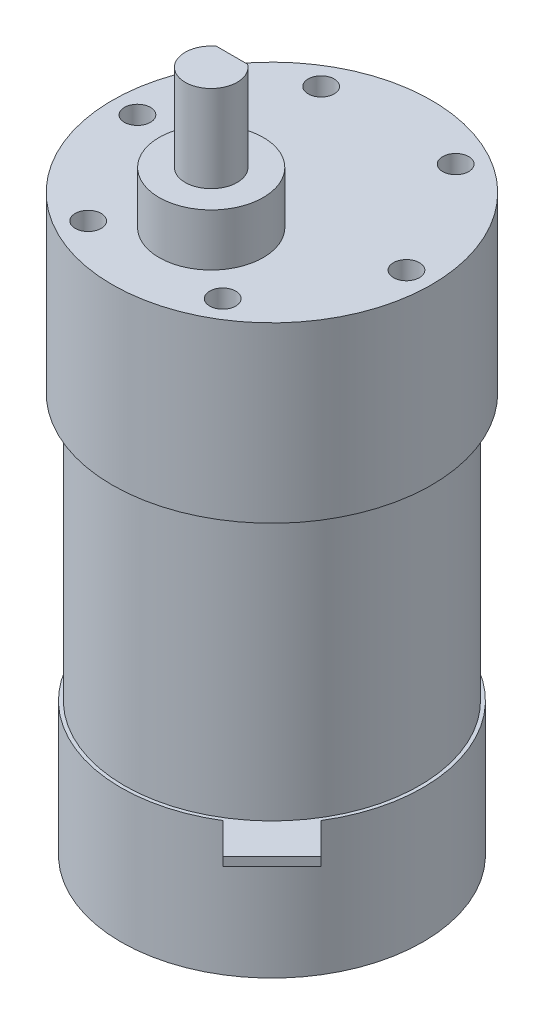
ISO-10303-21;
HEADER;
FILE_DESCRIPTION(('STEP AP214'),'2;1');
FILE_NAME('part.step','',(''),(''),'','','');
FILE_SCHEMA(('AUTOMOTIVE_DESIGN { 1 0 10303 214 1 1 1 1 }'));
ENDSEC;
DATA;
#1=APPLICATION_CONTEXT('core data for automotive mechanical design processes');
#2=APPLICATION_PROTOCOL_DEFINITION('international standard','automotive_design',2000,#1);
#3=PRODUCT_CONTEXT('',#1,'mechanical');
#4=PRODUCT('Part','Part','',(#3));
#5=PRODUCT_RELATED_PRODUCT_CATEGORY('part','',(#4));
#6=PRODUCT_DEFINITION_FORMATION('','',#4);
#7=PRODUCT_DEFINITION_CONTEXT('part definition',#1,'design');
#8=PRODUCT_DEFINITION('design','',#6,#7);
#9=PRODUCT_DEFINITION_SHAPE('','',#8);
#10=(LENGTH_UNIT() NAMED_UNIT(*) SI_UNIT(.MILLI.,.METRE.));
#11=(NAMED_UNIT(*) PLANE_ANGLE_UNIT() SI_UNIT($,.RADIAN.));
#12=(NAMED_UNIT(*) SI_UNIT($,.STERADIAN.) SOLID_ANGLE_UNIT());
#13=UNCERTAINTY_MEASURE_WITH_UNIT(LENGTH_MEASURE(1.E-05),#10,'distance_accuracy_value','');
#14=(GEOMETRIC_REPRESENTATION_CONTEXT(3) GLOBAL_UNCERTAINTY_ASSIGNED_CONTEXT((#13)) GLOBAL_UNIT_ASSIGNED_CONTEXT((#10,
#11,#12)) REPRESENTATION_CONTEXT('',''));
#15=CARTESIAN_POINT('',(0.,0.,0.));
#16=DIRECTION('',(0.,0.,1.));
#17=DIRECTION('',(1.,0.,0.));
#18=AXIS2_PLACEMENT_3D('',#15,#16,#17);
#19=CARTESIAN_POINT('',(0.,15.4,0.));
#20=DIRECTION('',(0.,-1.,0.));
#21=DIRECTION('',(0.,0.,-1.));
#22=AXIS2_PLACEMENT_3D('',#19,#20,#21);
#23=CYLINDRICAL_SURFACE('',#22,17.4);
#24=CARTESIAN_POINT('',(0.,0.,0.));
#25=DIRECTION('',(0.,1.,0.));
#26=DIRECTION('',(0.,0.,1.));
#27=AXIS2_PLACEMENT_3D('',#24,#25,#26);
#28=CIRCLE('',#27,17.4);
#29=CARTESIAN_POINT('',(0.,0.,17.4));
#30=VERTEX_POINT('',#29);
#31=EDGE_CURVE('E148',#30,#30,#28,.T.);
#32=ORIENTED_EDGE('',*,*,#31,.T.);
#33=EDGE_LOOP('',(#32));
#34=FACE_BOUND('',#33,.T.);
#35=DIRECTION('',(0.,-1.,0.));
#36=VECTOR('',#35,1.);
#37=CARTESIAN_POINT('',(14.8025659246767,15.4,9.14571167518424));
#38=LINE('',#37,#36);
#39=CARTESIAN_POINT('',(14.8025659246767,14.4,9.14571167518425));
#40=VERTEX_POINT('',#39);
#41=CARTESIAN_POINT('',(14.8025659246767,15.4,9.14571167518425));
#42=VERTEX_POINT('',#41);
#43=EDGE_CURVE('E112',#40,#42,#38,.F.);
#44=ORIENTED_EDGE('',*,*,#43,.F.);
#45=CARTESIAN_POINT('',(0.,14.4,0.));
#46=DIRECTION('',(0.,-1.,0.));
#47=DIRECTION('',(0.,0.,-1.));
#48=AXIS2_PLACEMENT_3D('',#45,#46,#47);
#49=CIRCLE('',#48,17.4);
#50=CARTESIAN_POINT('',(9.14571167518429,14.4,14.8025659246766));
#51=VERTEX_POINT('',#50);
#52=EDGE_CURVE('E11',#40,#51,#49,.T.);
#53=ORIENTED_EDGE('',*,*,#52,.T.);
#54=DIRECTION('',(0.,-1.,0.));
#55=VECTOR('',#54,1.);
#56=CARTESIAN_POINT('',(9.14571167518428,15.4,14.8025659246766));
#57=LINE('',#56,#55);
#58=CARTESIAN_POINT('',(9.14571167518429,15.4,14.8025659246766));
#59=VERTEX_POINT('',#58);
#60=EDGE_CURVE('E110',#59,#51,#57,.T.);
#61=ORIENTED_EDGE('',*,*,#60,.F.);
#62=CARTESIAN_POINT('',(0.,15.4,0.));
#63=DIRECTION('',(0.,1.,0.));
#64=DIRECTION('',(0.,0.,1.));
#65=AXIS2_PLACEMENT_3D('',#62,#63,#64);
#66=CIRCLE('',#65,17.4);
#67=EDGE_CURVE('E151',#42,#59,#66,.T.);
#68=ORIENTED_EDGE('',*,*,#67,.F.);
#69=EDGE_LOOP('',(#44,#53,#61,#68));
#70=FACE_BOUND('',#69,.T.);
#71=ADVANCED_FACE('F36',(#34,#70),#23,.T.);
#72=CARTESIAN_POINT('',(0.,15.4,0.));
#73=DIRECTION('',(0.,1.,0.));
#74=DIRECTION('',(0.,0.,1.));
#75=AXIS2_PLACEMENT_3D('',#72,#73,#74);
#76=PLANE('',#75);
#77=ORIENTED_EDGE('',*,*,#67,.T.);
#78=DIRECTION('',(-0.707106781186549,0.,-0.707106781186547));
#79=VECTOR('',#78,1.);
#80=CARTESIAN_POINT('',(-2.82842712474619,15.4,2.82842712474619));
#81=LINE('',#80,#79);
#82=CARTESIAN_POINT('',(12.7279220613579,15.4,18.3847763108502));
#83=VERTEX_POINT('',#82);
#84=EDGE_CURVE('E98',#83,#59,#81,.T.);
#85=ORIENTED_EDGE('',*,*,#84,.F.);
#86=DIRECTION('',(-0.707106781186546,0.,0.707106781186549));
#87=VECTOR('',#86,1.);
#88=CARTESIAN_POINT('',(18.3847763108502,15.4,12.7279220613578));
#89=LINE('',#88,#87);
#90=CARTESIAN_POINT('',(18.3847763108502,15.4,12.7279220613578));
#91=VERTEX_POINT('',#90);
#92=EDGE_CURVE('E188',#91,#83,#89,.T.);
#93=ORIENTED_EDGE('',*,*,#92,.F.);
#94=DIRECTION('',(0.707106781186549,0.,0.707106781186547));
#95=VECTOR('',#94,1.);
#96=CARTESIAN_POINT('',(2.82842712474619,15.4,-2.82842712474619));
#97=LINE('',#96,#95);
#98=EDGE_CURVE('E50',#42,#91,#97,.T.);
#99=ORIENTED_EDGE('',*,*,#98,.F.);
#100=EDGE_LOOP('',(#77,#85,#93,#99));
#101=FACE_BOUND('',#100,.T.);
#102=CARTESIAN_POINT('',(0.,15.4,0.));
#103=DIRECTION('',(0.,1.,0.));
#104=DIRECTION('',(0.,0.,1.));
#105=AXIS2_PLACEMENT_3D('',#102,#103,#104);
#106=CIRCLE('',#105,17.);
#107=CARTESIAN_POINT('',(0.,15.4,17.));
#108=VERTEX_POINT('',#107);
#109=EDGE_CURVE('E133',#108,#108,#106,.T.);
#110=ORIENTED_EDGE('',*,*,#109,.F.);
#111=EDGE_LOOP('',(#110));
#112=FACE_BOUND('',#111,.T.);
#113=ADVANCED_FACE('F175',(#101,#112),#76,.T.);
#114=CARTESIAN_POINT('',(0.,0.,0.));
#115=DIRECTION('',(0.,1.,0.));
#116=DIRECTION('',(0.,0.,1.));
#117=AXIS2_PLACEMENT_3D('',#114,#115,#116);
#118=PLANE('',#117);
#119=ORIENTED_EDGE('',*,*,#31,.F.);
#120=EDGE_LOOP('',(#119));
#121=FACE_BOUND('',#120,.T.);
#122=ADVANCED_FACE('F180',(#121),#118,.F.);
#123=CARTESIAN_POINT('',(0.,46.1,0.));
#124=DIRECTION('',(0.,-1.,0.));
#125=DIRECTION('',(0.,0.,-1.));
#126=AXIS2_PLACEMENT_3D('',#123,#124,#125);
#127=CYLINDRICAL_SURFACE('',#126,17.);
#128=CARTESIAN_POINT('',(0.,46.1,0.));
#129=DIRECTION('',(0.,1.,0.));
#130=DIRECTION('',(0.,0.,1.));
#131=AXIS2_PLACEMENT_3D('',#128,#129,#130);
#132=CIRCLE('',#131,17.);
#133=CARTESIAN_POINT('',(0.,46.1,17.));
#134=VERTEX_POINT('',#133);
#135=EDGE_CURVE('E143',#134,#134,#132,.T.);
#136=ORIENTED_EDGE('',*,*,#135,.F.);
#137=EDGE_LOOP('',(#136));
#138=FACE_BOUND('',#137,.T.);
#139=ORIENTED_EDGE('',*,*,#109,.T.);
#140=EDGE_LOOP('',(#139));
#141=FACE_BOUND('',#140,.T.);
#142=ADVANCED_FACE('F255',(#138,#141),#127,.T.);
#143=CARTESIAN_POINT('',(0.,66.1,0.));
#144=DIRECTION('',(0.,-1.,0.));
#145=DIRECTION('',(0.,0.,-1.));
#146=AXIS2_PLACEMENT_3D('',#143,#144,#145);
#147=CYLINDRICAL_SURFACE('',#146,18.4);
#148=CARTESIAN_POINT('',(0.,66.1,0.));
#149=DIRECTION('',(0.,1.,0.));
#150=DIRECTION('',(0.,0.,1.));
#151=AXIS2_PLACEMENT_3D('',#148,#149,#150);
#152=CIRCLE('',#151,18.4);
#153=CARTESIAN_POINT('',(0.,66.1,18.4));
#154=VERTEX_POINT('',#153);
#155=EDGE_CURVE('E140',#154,#154,#152,.T.);
#156=ORIENTED_EDGE('',*,*,#155,.F.);
#157=EDGE_LOOP('',(#156));
#158=FACE_BOUND('',#157,.T.);
#159=CARTESIAN_POINT('',(0.,46.1,0.));
#160=DIRECTION('',(0.,1.,0.));
#161=DIRECTION('',(0.,0.,1.));
#162=AXIS2_PLACEMENT_3D('',#159,#160,#161);
#163=CIRCLE('',#162,18.4);
#164=CARTESIAN_POINT('',(0.,46.1,18.4));
#165=VERTEX_POINT('',#164);
#166=EDGE_CURVE('E137',#165,#165,#163,.T.);
#167=ORIENTED_EDGE('',*,*,#166,.T.);
#168=EDGE_LOOP('',(#167));
#169=FACE_BOUND('',#168,.T.);
#170=ADVANCED_FACE('F244',(#158,#169),#147,.T.);
#171=CARTESIAN_POINT('',(0.,66.1,0.));
#172=DIRECTION('',(0.,1.,0.));
#173=DIRECTION('',(0.,0.,1.));
#174=AXIS2_PLACEMENT_3D('',#171,#172,#173);
#175=PLANE('',#174);
#176=CARTESIAN_POINT('',(7.75,66.1,13.4233937586588));
#177=DIRECTION('',(0.,1.,0.));
#178=DIRECTION('',(0.,0.,1.));
#179=AXIS2_PLACEMENT_3D('',#176,#177,#178);
#180=CIRCLE('',#179,1.5);
#181=CARTESIAN_POINT('',(7.75,66.1,14.9233937586588));
#182=VERTEX_POINT('',#181);
#183=EDGE_CURVE('E213',#182,#182,#180,.T.);
#184=ORIENTED_EDGE('',*,*,#183,.F.);
#185=EDGE_LOOP('',(#184));
#186=FACE_BOUND('',#185,.T.);
#187=CARTESIAN_POINT('',(15.5,66.1,0.));
#188=DIRECTION('',(0.,1.,0.));
#189=DIRECTION('',(0.,0.,1.));
#190=AXIS2_PLACEMENT_3D('',#187,#188,#189);
#191=CIRCLE('',#190,1.5);
#192=CARTESIAN_POINT('',(15.5,66.1,1.50000000000001));
#193=VERTEX_POINT('',#192);
#194=EDGE_CURVE('E220',#193,#193,#191,.T.);
#195=ORIENTED_EDGE('',*,*,#194,.F.);
#196=EDGE_LOOP('',(#195));
#197=FACE_BOUND('',#196,.T.);
#198=CARTESIAN_POINT('',(-15.5,66.1,0.));
#199=DIRECTION('',(0.,1.,0.));
#200=DIRECTION('',(0.,0.,1.));
#201=AXIS2_PLACEMENT_3D('',#198,#199,#200);
#202=CIRCLE('',#201,1.5);
#203=CARTESIAN_POINT('',(-15.5,66.1,1.5));
#204=VERTEX_POINT('',#203);
#205=EDGE_CURVE('E201',#204,#204,#202,.T.);
#206=ORIENTED_EDGE('',*,*,#205,.F.);
#207=EDGE_LOOP('',(#206));
#208=FACE_BOUND('',#207,.T.);
#209=CARTESIAN_POINT('',(7.75,66.1,-13.4233937586588));
#210=DIRECTION('',(0.,1.,0.));
#211=DIRECTION('',(0.,0.,1.));
#212=AXIS2_PLACEMENT_3D('',#209,#210,#211);
#213=CIRCLE('',#212,1.5);
#214=CARTESIAN_POINT('',(7.75,66.1,-11.9233937586588));
#215=VERTEX_POINT('',#214);
#216=EDGE_CURVE('E208',#215,#215,#213,.T.);
#217=ORIENTED_EDGE('',*,*,#216,.F.);
#218=EDGE_LOOP('',(#217));
#219=FACE_BOUND('',#218,.T.);
#220=CARTESIAN_POINT('',(-7.75,66.1,13.4233937586588));
#221=DIRECTION('',(0.,1.,0.));
#222=DIRECTION('',(0.,0.,1.));
#223=AXIS2_PLACEMENT_3D('',#220,#221,#222);
#224=CIRCLE('',#223,1.5);
#225=CARTESIAN_POINT('',(-7.75,66.1,14.9233937586588));
#226=VERTEX_POINT('',#225);
#227=EDGE_CURVE('E225',#226,#226,#224,.T.);
#228=ORIENTED_EDGE('',*,*,#227,.F.);
#229=EDGE_LOOP('',(#228));
#230=FACE_BOUND('',#229,.T.);
#231=CARTESIAN_POINT('',(-7.75,66.1,-13.4233937586588));
#232=DIRECTION('',(0.,1.,0.));
#233=DIRECTION('',(0.,0.,1.));
#234=AXIS2_PLACEMENT_3D('',#231,#232,#233);
#235=CIRCLE('',#234,1.5);
#236=CARTESIAN_POINT('',(-7.75,66.1,-11.9233937586588));
#237=VERTEX_POINT('',#236);
#238=EDGE_CURVE('E195',#237,#237,#235,.T.);
#239=ORIENTED_EDGE('',*,*,#238,.F.);
#240=EDGE_LOOP('',(#239));
#241=FACE_BOUND('',#240,.T.);
#242=CARTESIAN_POINT('',(0.,66.1,7.));
#243=DIRECTION('',(0.,1.,0.));
#244=DIRECTION('',(0.,0.,1.));
#245=AXIS2_PLACEMENT_3D('',#242,#243,#244);
#246=CIRCLE('',#245,6.);
#247=CARTESIAN_POINT('',(0.,66.1,13.));
#248=VERTEX_POINT('',#247);
#249=EDGE_CURVE('E128',#248,#248,#246,.T.);
#250=ORIENTED_EDGE('',*,*,#249,.F.);
#251=EDGE_LOOP('',(#250));
#252=FACE_BOUND('',#251,.T.);
#253=ORIENTED_EDGE('',*,*,#155,.T.);
#254=EDGE_LOOP('',(#253));
#255=FACE_BOUND('',#254,.T.);
#256=ADVANCED_FACE('F240',(#186,#197,#208,#219,#230,#241,#252,#255),#175,.T.);
#257=CARTESIAN_POINT('',(0.,46.1,0.));
#258=DIRECTION('',(0.,1.,0.));
#259=DIRECTION('',(0.,0.,1.));
#260=AXIS2_PLACEMENT_3D('',#257,#258,#259);
#261=PLANE('',#260);
#262=ORIENTED_EDGE('',*,*,#135,.T.);
#263=EDGE_LOOP('',(#262));
#264=FACE_BOUND('',#263,.T.);
#265=ORIENTED_EDGE('',*,*,#166,.F.);
#266=EDGE_LOOP('',(#265));
#267=FACE_BOUND('',#266,.T.);
#268=ADVANCED_FACE('F243',(#264,#267),#261,.F.);
#269=CARTESIAN_POINT('',(0.,72.1,7.));
#270=DIRECTION('',(0.,-1.,0.));
#271=DIRECTION('',(0.,0.,-1.));
#272=AXIS2_PLACEMENT_3D('',#269,#270,#271);
#273=CYLINDRICAL_SURFACE('',#272,6.);
#274=CARTESIAN_POINT('',(0.,72.1,7.));
#275=DIRECTION('',(0.,1.,0.));
#276=DIRECTION('',(0.,0.,1.));
#277=AXIS2_PLACEMENT_3D('',#274,#275,#276);
#278=CIRCLE('',#277,6.);
#279=CARTESIAN_POINT('',(0.,72.1,13.));
#280=VERTEX_POINT('',#279);
#281=EDGE_CURVE('E134',#280,#280,#278,.T.);
#282=ORIENTED_EDGE('',*,*,#281,.F.);
#283=EDGE_LOOP('',(#282));
#284=FACE_BOUND('',#283,.T.);
#285=ORIENTED_EDGE('',*,*,#249,.T.);
#286=EDGE_LOOP('',(#285));
#287=FACE_BOUND('',#286,.T.);
#288=ADVANCED_FACE('F260',(#284,#287),#273,.T.);
#289=CARTESIAN_POINT('',(0.,72.1,7.));
#290=DIRECTION('',(0.,1.,0.));
#291=DIRECTION('',(0.,0.,1.));
#292=AXIS2_PLACEMENT_3D('',#289,#290,#291);
#293=PLANE('',#292);
#294=CARTESIAN_POINT('',(0.,72.1,7.));
#295=DIRECTION('',(0.,1.,0.));
#296=DIRECTION('',(0.,0.,1.));
#297=AXIS2_PLACEMENT_3D('',#294,#295,#296);
#298=CIRCLE('',#297,3.);
#299=CARTESIAN_POINT('',(0.,72.1,10.));
#300=VERTEX_POINT('',#299);
#301=EDGE_CURVE('E129',#300,#300,#298,.T.);
#302=ORIENTED_EDGE('',*,*,#301,.F.);
#303=EDGE_LOOP('',(#302));
#304=FACE_BOUND('',#303,.T.);
#305=ORIENTED_EDGE('',*,*,#281,.T.);
#306=EDGE_LOOP('',(#305));
#307=FACE_BOUND('',#306,.T.);
#308=ADVANCED_FACE('F172',(#304,#307),#293,.T.);
#309=CARTESIAN_POINT('',(0.,82.1,7.));
#310=DIRECTION('',(0.,-1.,0.));
#311=DIRECTION('',(0.,0.,-1.));
#312=AXIS2_PLACEMENT_3D('',#309,#310,#311);
#313=CYLINDRICAL_SURFACE('',#312,3.);
#314=CARTESIAN_POINT('',(0.,82.1,7.));
#315=DIRECTION('',(0.,1.,0.));
#316=DIRECTION('',(0.,0.,1.));
#317=AXIS2_PLACEMENT_3D('',#314,#315,#316);
#318=CIRCLE('',#317,3.);
#319=CARTESIAN_POINT('',(-1.8,82.1,4.6));
#320=VERTEX_POINT('',#319);
#321=CARTESIAN_POINT('',(1.8,82.1,4.6));
#322=VERTEX_POINT('',#321);
#323=EDGE_CURVE('E125',#320,#322,#318,.T.);
#324=ORIENTED_EDGE('',*,*,#323,.F.);
#325=DIRECTION('',(0.,-1.,0.));
#326=VECTOR('',#325,1.);
#327=CARTESIAN_POINT('',(-1.8,82.1,4.6));
#328=LINE('',#327,#326);
#329=CARTESIAN_POINT('',(-1.8,74.1,4.6));
#330=VERTEX_POINT('',#329);
#331=EDGE_CURVE('E58',#320,#330,#328,.T.);
#332=ORIENTED_EDGE('',*,*,#331,.T.);
#333=CARTESIAN_POINT('',(0.,74.1,7.));
#334=DIRECTION('',(0.,-1.,0.));
#335=DIRECTION('',(0.,0.,-1.));
#336=AXIS2_PLACEMENT_3D('',#333,#334,#335);
#337=CIRCLE('',#336,3.);
#338=CARTESIAN_POINT('',(1.8,74.1,4.6));
#339=VERTEX_POINT('',#338);
#340=EDGE_CURVE('E43',#330,#339,#337,.T.);
#341=ORIENTED_EDGE('',*,*,#340,.T.);
#342=DIRECTION('',(0.,-1.,0.));
#343=VECTOR('',#342,1.);
#344=CARTESIAN_POINT('',(1.8,82.1,4.6));
#345=LINE('',#344,#343);
#346=EDGE_CURVE('E121',#339,#322,#345,.F.);
#347=ORIENTED_EDGE('',*,*,#346,.T.);
#348=EDGE_LOOP('',(#324,#332,#341,#347));
#349=FACE_BOUND('',#348,.T.);
#350=ORIENTED_EDGE('',*,*,#301,.T.);
#351=EDGE_LOOP('',(#350));
#352=FACE_BOUND('',#351,.T.);
#353=ADVANCED_FACE('F158',(#349,#352),#313,.T.);
#354=CARTESIAN_POINT('',(0.,82.1,7.));
#355=DIRECTION('',(0.,1.,0.));
#356=DIRECTION('',(0.,0.,1.));
#357=AXIS2_PLACEMENT_3D('',#354,#355,#356);
#358=PLANE('',#357);
#359=DIRECTION('',(1.,0.,0.));
#360=VECTOR('',#359,1.);
#361=CARTESIAN_POINT('',(0.,82.1,4.6));
#362=LINE('',#361,#360);
#363=EDGE_CURVE('E132',#320,#322,#362,.T.);
#364=ORIENTED_EDGE('',*,*,#363,.F.);
#365=ORIENTED_EDGE('',*,*,#323,.T.);
#366=EDGE_LOOP('',(#364,#365));
#367=FACE_BOUND('',#366,.T.);
#368=ADVANCED_FACE('F164',(#367),#358,.T.);
#369=CARTESIAN_POINT('',(-3.,74.1,-5.4));
#370=DIRECTION('',(0.,-1.,0.));
#371=DIRECTION('',(0.,0.,-1.));
#372=AXIS2_PLACEMENT_3D('',#369,#370,#371);
#373=PLANE('',#372);
#374=DIRECTION('',(1.,0.,0.));
#375=VECTOR('',#374,1.);
#376=CARTESIAN_POINT('',(-3.,74.1,4.6));
#377=LINE('',#376,#375);
#378=EDGE_CURVE('E118',#330,#339,#377,.T.);
#379=ORIENTED_EDGE('',*,*,#378,.T.);
#380=ORIENTED_EDGE('',*,*,#340,.F.);
#381=EDGE_LOOP('',(#379,#380));
#382=FACE_BOUND('',#381,.T.);
#383=ADVANCED_FACE('F161',(#382),#373,.F.);
#384=CARTESIAN_POINT('',(0.,0.,4.6));
#385=DIRECTION('',(0.,0.,1.));
#386=DIRECTION('',(1.,0.,0.));
#387=AXIS2_PLACEMENT_3D('',#384,#385,#386);
#388=PLANE('',#387);
#389=ORIENTED_EDGE('',*,*,#363,.T.);
#390=ORIENTED_EDGE('',*,*,#346,.F.);
#391=ORIENTED_EDGE('',*,*,#378,.F.);
#392=ORIENTED_EDGE('',*,*,#331,.F.);
#393=EDGE_LOOP('',(#389,#390,#391,#392));
#394=FACE_BOUND('',#393,.T.);
#395=ADVANCED_FACE('F162',(#394),#388,.F.);
#396=CARTESIAN_POINT('',(2.82842712474619,14.4,-2.82842712474619));
#397=DIRECTION('',(-0.707106781186547,0.,0.707106781186549));
#398=DIRECTION('',(0.707106781186549,0.,0.707106781186547));
#399=AXIS2_PLACEMENT_3D('',#396,#397,#398);
#400=PLANE('',#399);
#401=DIRECTION('',(0.707106781186549,0.,0.707106781186547));
#402=VECTOR('',#401,1.);
#403=CARTESIAN_POINT('',(2.82842712474619,14.4,-2.82842712474619));
#404=LINE('',#403,#402);
#405=CARTESIAN_POINT('',(18.3847763108502,14.4,12.7279220613578));
#406=VERTEX_POINT('',#405);
#407=EDGE_CURVE('E89',#40,#406,#404,.T.);
#408=ORIENTED_EDGE('',*,*,#407,.F.);
#409=ORIENTED_EDGE('',*,*,#43,.T.);
#410=ORIENTED_EDGE('',*,*,#98,.T.);
#411=DIRECTION('',(0.,1.,0.));
#412=VECTOR('',#411,1.);
#413=CARTESIAN_POINT('',(18.3847763108502,14.4,12.7279220613578));
#414=LINE('',#413,#412);
#415=EDGE_CURVE('E103',#406,#91,#414,.T.);
#416=ORIENTED_EDGE('',*,*,#415,.F.);
#417=EDGE_LOOP('',(#408,#409,#410,#416));
#418=FACE_BOUND('',#417,.T.);
#419=ADVANCED_FACE('F109',(#418),#400,.F.);
#420=CARTESIAN_POINT('',(-2.82842712474619,14.4,2.82842712474619));
#421=DIRECTION('',(0.707106781186547,0.,-0.707106781186549));
#422=DIRECTION('',(-0.707106781186549,0.,-0.707106781186547));
#423=AXIS2_PLACEMENT_3D('',#420,#421,#422);
#424=PLANE('',#423);
#425=ORIENTED_EDGE('',*,*,#84,.T.);
#426=ORIENTED_EDGE('',*,*,#60,.T.);
#427=DIRECTION('',(-0.707106781186549,0.,-0.707106781186547));
#428=VECTOR('',#427,1.);
#429=CARTESIAN_POINT('',(-2.82842712474619,14.4,2.82842712474619));
#430=LINE('',#429,#428);
#431=CARTESIAN_POINT('',(12.7279220613579,14.4,18.3847763108502));
#432=VERTEX_POINT('',#431);
#433=EDGE_CURVE('E107',#432,#51,#430,.T.);
#434=ORIENTED_EDGE('',*,*,#433,.F.);
#435=DIRECTION('',(0.,1.,0.));
#436=VECTOR('',#435,1.);
#437=CARTESIAN_POINT('',(12.7279220613579,14.4,18.3847763108502));
#438=LINE('',#437,#436);
#439=EDGE_CURVE('E105',#432,#83,#438,.T.);
#440=ORIENTED_EDGE('',*,*,#439,.T.);
#441=EDGE_LOOP('',(#425,#426,#434,#440));
#442=FACE_BOUND('',#441,.T.);
#443=ADVANCED_FACE('F415',(#442),#424,.F.);
#444=CARTESIAN_POINT('',(18.3847763108502,14.4,12.7279220613578));
#445=DIRECTION('',(-0.707106781186549,0.,-0.707106781186546));
#446=DIRECTION('',(-0.707106781186546,0.,0.707106781186549));
#447=AXIS2_PLACEMENT_3D('',#444,#445,#446);
#448=PLANE('',#447);
#449=ORIENTED_EDGE('',*,*,#92,.T.);
#450=ORIENTED_EDGE('',*,*,#439,.F.);
#451=DIRECTION('',(-0.707106781186546,0.,0.707106781186549));
#452=VECTOR('',#451,1.);
#453=CARTESIAN_POINT('',(18.3847763108502,14.4,12.7279220613578));
#454=LINE('',#453,#452);
#455=EDGE_CURVE('E93',#406,#432,#454,.T.);
#456=ORIENTED_EDGE('',*,*,#455,.F.);
#457=ORIENTED_EDGE('',*,*,#415,.T.);
#458=EDGE_LOOP('',(#449,#450,#456,#457));
#459=FACE_BOUND('',#458,.T.);
#460=ADVANCED_FACE('F102',(#459),#448,.F.);
#461=CARTESIAN_POINT('',(0.,14.4,0.));
#462=DIRECTION('',(0.,-1.,0.));
#463=DIRECTION('',(0.,0.,-1.));
#464=AXIS2_PLACEMENT_3D('',#461,#462,#463);
#465=PLANE('',#464);
#466=ORIENTED_EDGE('',*,*,#52,.F.);
#467=ORIENTED_EDGE('',*,*,#407,.T.);
#468=ORIENTED_EDGE('',*,*,#455,.T.);
#469=ORIENTED_EDGE('',*,*,#433,.T.);
#470=EDGE_LOOP('',(#466,#467,#468,#469));
#471=FACE_BOUND('',#470,.T.);
#472=ADVANCED_FACE('F91',(#471),#465,.T.);
#473=CARTESIAN_POINT('',(-7.75,63.1,-13.4233937586588));
#474=DIRECTION('',(0.,1.,0.));
#475=DIRECTION('',(0.,0.,1.));
#476=AXIS2_PLACEMENT_3D('',#473,#474,#475);
#477=CYLINDRICAL_SURFACE('',#476,1.5);
#478=CARTESIAN_POINT('',(-7.75,63.1,-13.4233937586588));
#479=DIRECTION('',(0.,1.,0.));
#480=DIRECTION('',(0.,0.,1.));
#481=AXIS2_PLACEMENT_3D('',#478,#479,#480);
#482=CIRCLE('',#481,1.5);
#483=CARTESIAN_POINT('',(-7.75,63.1,-11.9233937586588));
#484=VERTEX_POINT('',#483);
#485=EDGE_CURVE('E193',#484,#484,#482,.T.);
#486=ORIENTED_EDGE('',*,*,#485,.F.);
#487=EDGE_LOOP('',(#486));
#488=FACE_BOUND('',#487,.T.);
#489=ORIENTED_EDGE('',*,*,#238,.T.);
#490=EDGE_LOOP('',(#489));
#491=FACE_BOUND('',#490,.T.);
#492=ADVANCED_FACE('F301',(#488,#491),#477,.F.);
#493=CARTESIAN_POINT('',(-7.75,63.1,-13.4233937586588));
#494=DIRECTION('',(0.,1.,0.));
#495=DIRECTION('',(0.,0.,1.));
#496=AXIS2_PLACEMENT_3D('',#493,#494,#495);
#497=PLANE('',#496);
#498=ORIENTED_EDGE('',*,*,#485,.T.);
#499=EDGE_LOOP('',(#498));
#500=FACE_BOUND('',#499,.T.);
#501=ADVANCED_FACE('F236',(#500),#497,.T.);
#502=CARTESIAN_POINT('',(-7.75,63.1,13.4233937586588));
#503=DIRECTION('',(0.,1.,0.));
#504=DIRECTION('',(0.,0.,1.));
#505=AXIS2_PLACEMENT_3D('',#502,#503,#504);
#506=CYLINDRICAL_SURFACE('',#505,1.5);
#507=CARTESIAN_POINT('',(-7.75,63.1,13.4233937586588));
#508=DIRECTION('',(0.,1.,0.));
#509=DIRECTION('',(0.,0.,1.));
#510=AXIS2_PLACEMENT_3D('',#507,#508,#509);
#511=CIRCLE('',#510,1.5);
#512=CARTESIAN_POINT('',(-7.75,63.1,14.9233937586588));
#513=VERTEX_POINT('',#512);
#514=EDGE_CURVE('E217',#513,#513,#511,.T.);
#515=ORIENTED_EDGE('',*,*,#514,.F.);
#516=EDGE_LOOP('',(#515));
#517=FACE_BOUND('',#516,.T.);
#518=ORIENTED_EDGE('',*,*,#227,.T.);
#519=EDGE_LOOP('',(#518));
#520=FACE_BOUND('',#519,.T.);
#521=ADVANCED_FACE('F233',(#517,#520),#506,.F.);
#522=CARTESIAN_POINT('',(-7.75,63.1,13.4233937586588));
#523=DIRECTION('',(0.,1.,0.));
#524=DIRECTION('',(0.,0.,1.));
#525=AXIS2_PLACEMENT_3D('',#522,#523,#524);
#526=PLANE('',#525);
#527=ORIENTED_EDGE('',*,*,#514,.T.);
#528=EDGE_LOOP('',(#527));
#529=FACE_BOUND('',#528,.T.);
#530=ADVANCED_FACE('F231',(#529),#526,.T.);
#531=CARTESIAN_POINT('',(7.75,63.1,-13.4233937586588));
#532=DIRECTION('',(0.,1.,0.));
#533=DIRECTION('',(0.,0.,1.));
#534=AXIS2_PLACEMENT_3D('',#531,#532,#533);
#535=CYLINDRICAL_SURFACE('',#534,1.5);
#536=CARTESIAN_POINT('',(7.75,63.1,-13.4233937586588));
#537=DIRECTION('',(0.,1.,0.));
#538=DIRECTION('',(0.,0.,1.));
#539=AXIS2_PLACEMENT_3D('',#536,#537,#538);
#540=CIRCLE('',#539,1.5);
#541=CARTESIAN_POINT('',(7.75,63.1,-11.9233937586588));
#542=VERTEX_POINT('',#541);
#543=EDGE_CURVE('E198',#542,#542,#540,.T.);
#544=ORIENTED_EDGE('',*,*,#543,.F.);
#545=EDGE_LOOP('',(#544));
#546=FACE_BOUND('',#545,.T.);
#547=ORIENTED_EDGE('',*,*,#216,.T.);
#548=EDGE_LOOP('',(#547));
#549=FACE_BOUND('',#548,.T.);
#550=ADVANCED_FACE('F330',(#546,#549),#535,.F.);
#551=CARTESIAN_POINT('',(7.75,63.1,-13.4233937586588));
#552=DIRECTION('',(0.,1.,0.));
#553=DIRECTION('',(0.,0.,1.));
#554=AXIS2_PLACEMENT_3D('',#551,#552,#553);
#555=PLANE('',#554);
#556=ORIENTED_EDGE('',*,*,#543,.T.);
#557=EDGE_LOOP('',(#556));
#558=FACE_BOUND('',#557,.T.);
#559=ADVANCED_FACE('F339',(#558),#555,.T.);
#560=CARTESIAN_POINT('',(-15.5,63.1,0.));
#561=DIRECTION('',(0.,1.,0.));
#562=DIRECTION('',(0.,0.,1.));
#563=AXIS2_PLACEMENT_3D('',#560,#561,#562);
#564=CYLINDRICAL_SURFACE('',#563,1.5);
#565=CARTESIAN_POINT('',(-15.5,63.1,0.));
#566=DIRECTION('',(0.,1.,0.));
#567=DIRECTION('',(0.,0.,1.));
#568=AXIS2_PLACEMENT_3D('',#565,#566,#567);
#569=CIRCLE('',#568,1.5);
#570=CARTESIAN_POINT('',(-15.5,63.1,1.5));
#571=VERTEX_POINT('',#570);
#572=EDGE_CURVE('E204',#571,#571,#569,.T.);
#573=ORIENTED_EDGE('',*,*,#572,.F.);
#574=EDGE_LOOP('',(#573));
#575=FACE_BOUND('',#574,.T.);
#576=ORIENTED_EDGE('',*,*,#205,.T.);
#577=EDGE_LOOP('',(#576));
#578=FACE_BOUND('',#577,.T.);
#579=ADVANCED_FACE('F349',(#575,#578),#564,.F.);
#580=CARTESIAN_POINT('',(-15.5,63.1,0.));
#581=DIRECTION('',(0.,1.,0.));
#582=DIRECTION('',(0.,0.,1.));
#583=AXIS2_PLACEMENT_3D('',#580,#581,#582);
#584=PLANE('',#583);
#585=ORIENTED_EDGE('',*,*,#572,.T.);
#586=EDGE_LOOP('',(#585));
#587=FACE_BOUND('',#586,.T.);
#588=ADVANCED_FACE('F359',(#587),#584,.T.);
#589=CARTESIAN_POINT('',(15.5,63.1,0.));
#590=DIRECTION('',(0.,1.,0.));
#591=DIRECTION('',(0.,0.,1.));
#592=AXIS2_PLACEMENT_3D('',#589,#590,#591);
#593=CYLINDRICAL_SURFACE('',#592,1.5);
#594=CARTESIAN_POINT('',(15.5,63.1,0.));
#595=DIRECTION('',(0.,1.,0.));
#596=DIRECTION('',(0.,0.,1.));
#597=AXIS2_PLACEMENT_3D('',#594,#595,#596);
#598=CIRCLE('',#597,1.5);
#599=CARTESIAN_POINT('',(15.5,63.1,1.50000000000001));
#600=VERTEX_POINT('',#599);
#601=EDGE_CURVE('E205',#600,#600,#598,.T.);
#602=ORIENTED_EDGE('',*,*,#601,.F.);
#603=EDGE_LOOP('',(#602));
#604=FACE_BOUND('',#603,.T.);
#605=ORIENTED_EDGE('',*,*,#194,.T.);
#606=EDGE_LOOP('',(#605));
#607=FACE_BOUND('',#606,.T.);
#608=ADVANCED_FACE('F369',(#604,#607),#593,.F.);
#609=CARTESIAN_POINT('',(15.5,63.1,0.));
#610=DIRECTION('',(0.,1.,0.));
#611=DIRECTION('',(0.,0.,1.));
#612=AXIS2_PLACEMENT_3D('',#609,#610,#611);
#613=PLANE('',#612);
#614=ORIENTED_EDGE('',*,*,#601,.T.);
#615=EDGE_LOOP('',(#614));
#616=FACE_BOUND('',#615,.T.);
#617=ADVANCED_FACE('F379',(#616),#613,.T.);
#618=CARTESIAN_POINT('',(7.75,63.1,13.4233937586588));
#619=DIRECTION('',(0.,1.,0.));
#620=DIRECTION('',(0.,0.,1.));
#621=AXIS2_PLACEMENT_3D('',#618,#619,#620);
#622=CYLINDRICAL_SURFACE('',#621,1.5);
#623=CARTESIAN_POINT('',(7.75,63.1,13.4233937586588));
#624=DIRECTION('',(0.,1.,0.));
#625=DIRECTION('',(0.,0.,1.));
#626=AXIS2_PLACEMENT_3D('',#623,#624,#625);
#627=CIRCLE('',#626,1.5);
#628=CARTESIAN_POINT('',(7.75,63.1,14.9233937586588));
#629=VERTEX_POINT('',#628);
#630=EDGE_CURVE('E216',#629,#629,#627,.T.);
#631=ORIENTED_EDGE('',*,*,#630,.F.);
#632=EDGE_LOOP('',(#631));
#633=FACE_BOUND('',#632,.T.);
#634=ORIENTED_EDGE('',*,*,#183,.T.);
#635=EDGE_LOOP('',(#634));
#636=FACE_BOUND('',#635,.T.);
#637=ADVANCED_FACE('F389',(#633,#636),#622,.F.);
#638=CARTESIAN_POINT('',(7.75,63.1,13.4233937586588));
#639=DIRECTION('',(0.,1.,0.));
#640=DIRECTION('',(0.,0.,1.));
#641=AXIS2_PLACEMENT_3D('',#638,#639,#640);
#642=PLANE('',#641);
#643=ORIENTED_EDGE('',*,*,#630,.T.);
#644=EDGE_LOOP('',(#643));
#645=FACE_BOUND('',#644,.T.);
#646=ADVANCED_FACE('F399',(#645),#642,.T.);
#647=CLOSED_SHELL('',(#71,#113,#122,#142,#170,#256,#268,#288,#308,#353,#368,#383,#395,#419,#443,
#460,#472,#492,#501,#521,#530,#550,#559,#579,#588,#608,#617,#637,#646));
#648=MANIFOLD_SOLID_BREP('B2',#647);
#649=ADVANCED_BREP_SHAPE_REPRESENTATION('',(#18,#648),#14);
#650=SHAPE_DEFINITION_REPRESENTATION(#9,#649);
ENDSEC;
END-ISO-10303-21;
